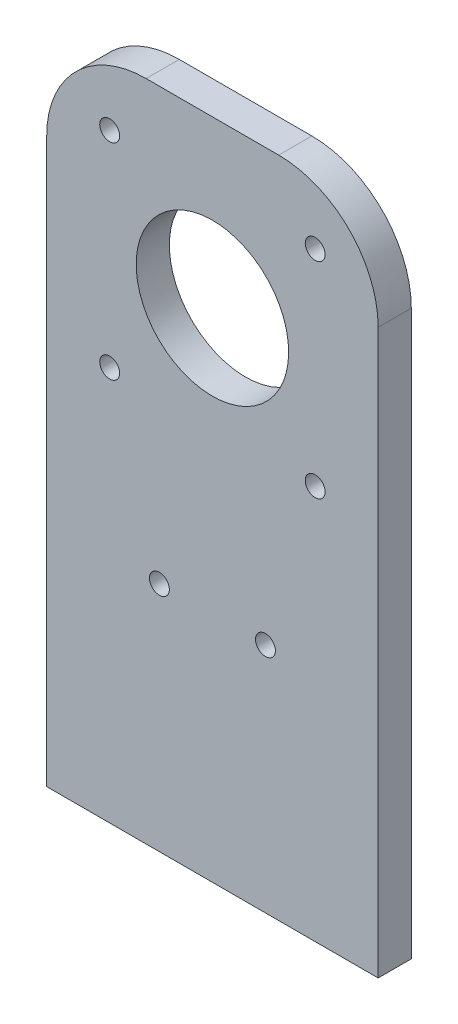
ISO-10303-21;
HEADER;
FILE_DESCRIPTION(('STEP AP214'),'2;1');
FILE_NAME('part.step','',(''),(''),'','','');
FILE_SCHEMA(('AUTOMOTIVE_DESIGN { 1 0 10303 214 1 1 1 1 }'));
ENDSEC;
DATA;
#1=APPLICATION_CONTEXT('core data for automotive mechanical design processes');
#2=APPLICATION_PROTOCOL_DEFINITION('international standard','automotive_design',2000,#1);
#3=PRODUCT_CONTEXT('',#1,'mechanical');
#4=PRODUCT('Part','Part','',(#3));
#5=PRODUCT_RELATED_PRODUCT_CATEGORY('part','',(#4));
#6=PRODUCT_DEFINITION_FORMATION('','',#4);
#7=PRODUCT_DEFINITION_CONTEXT('part definition',#1,'design');
#8=PRODUCT_DEFINITION('design','',#6,#7);
#9=PRODUCT_DEFINITION_SHAPE('','',#8);
#10=(LENGTH_UNIT() NAMED_UNIT(*) SI_UNIT(.MILLI.,.METRE.));
#11=(NAMED_UNIT(*) PLANE_ANGLE_UNIT() SI_UNIT($,.RADIAN.));
#12=(NAMED_UNIT(*) SI_UNIT($,.STERADIAN.) SOLID_ANGLE_UNIT());
#13=UNCERTAINTY_MEASURE_WITH_UNIT(LENGTH_MEASURE(1.E-05),#10,'distance_accuracy_value','');
#14=(GEOMETRIC_REPRESENTATION_CONTEXT(3) GLOBAL_UNCERTAINTY_ASSIGNED_CONTEXT((#13)) GLOBAL_UNIT_ASSIGNED_CONTEXT((#10,
#11,#12)) REPRESENTATION_CONTEXT('',''));
#15=CARTESIAN_POINT('',(0.,0.,0.));
#16=DIRECTION('',(0.,0.,1.));
#17=DIRECTION('',(1.,0.,0.));
#18=AXIS2_PLACEMENT_3D('',#15,#16,#17);
#19=CARTESIAN_POINT('',(9.91259609725116,92.0888197016812,5.));
#20=DIRECTION('',(0.,0.,-1.));
#21=DIRECTION('',(-1.,0.,0.));
#22=AXIS2_PLACEMENT_3D('',#19,#20,#21);
#23=PLANE('',#22);
#24=DIRECTION('',(1.,0.,0.));
#25=VECTOR('',#24,1.);
#26=CARTESIAN_POINT('',(-25.0874039027488,7.08881970168123,5.));
#27=LINE('',#26,#25);
#28=CARTESIAN_POINT('',(-25.0874039027488,7.08881970168123,5.));
#29=VERTEX_POINT('',#28);
#30=CARTESIAN_POINT('',(24.9125960972512,7.08881970168123,5.));
#31=VERTEX_POINT('',#30);
#32=EDGE_CURVE('E133',#29,#31,#27,.T.);
#33=ORIENTED_EDGE('',*,*,#32,.T.);
#34=DIRECTION('',(0.,1.,0.));
#35=VECTOR('',#34,1.);
#36=CARTESIAN_POINT('',(24.9125960972512,7.08881970168123,5.));
#37=LINE('',#36,#35);
#38=CARTESIAN_POINT('',(24.9125960972512,92.0888197016811,5.));
#39=VERTEX_POINT('',#38);
#40=EDGE_CURVE('E91',#31,#39,#37,.T.);
#41=ORIENTED_EDGE('',*,*,#40,.T.);
#42=CARTESIAN_POINT('',(9.91259609725116,92.0888197016812,5.));
#43=DIRECTION('',(0.,0.,1.));
#44=DIRECTION('',(-1.,0.,0.));
#45=AXIS2_PLACEMENT_3D('',#42,#43,#44);
#46=CIRCLE('',#45,15.);
#47=CARTESIAN_POINT('',(9.91259609725106,107.088819701681,5.));
#48=VERTEX_POINT('',#47);
#49=EDGE_CURVE('E104',#39,#48,#46,.T.);
#50=ORIENTED_EDGE('',*,*,#49,.T.);
#51=DIRECTION('',(-1.,0.,0.));
#52=VECTOR('',#51,1.);
#53=CARTESIAN_POINT('',(-10.0874039027487,107.088819701681,5.));
#54=LINE('',#53,#52);
#55=CARTESIAN_POINT('',(-10.0874039027487,107.088819701681,5.));
#56=VERTEX_POINT('',#55);
#57=EDGE_CURVE('E98',#48,#56,#54,.T.);
#58=ORIENTED_EDGE('',*,*,#57,.T.);
#59=CARTESIAN_POINT('',(-10.0874039027488,92.0888197016812,5.));
#60=DIRECTION('',(0.,0.,1.));
#61=DIRECTION('',(-1.,0.,0.));
#62=AXIS2_PLACEMENT_3D('',#59,#60,#61);
#63=CIRCLE('',#62,15.);
#64=CARTESIAN_POINT('',(-25.0874039027488,92.0888197016811,5.));
#65=VERTEX_POINT('',#64);
#66=EDGE_CURVE('E102',#56,#65,#63,.T.);
#67=ORIENTED_EDGE('',*,*,#66,.T.);
#68=DIRECTION('',(0.,-1.,0.));
#69=VECTOR('',#68,1.);
#70=CARTESIAN_POINT('',(-25.0874039027488,92.0888197016811,5.));
#71=LINE('',#70,#69);
#72=EDGE_CURVE('E54',#65,#29,#71,.T.);
#73=ORIENTED_EDGE('',*,*,#72,.T.);
#74=EDGE_LOOP('',(#33,#41,#50,#58,#67,#73));
#75=FACE_BOUND('',#74,.T.);
#76=CARTESIAN_POINT('',(-0.0874039027488199,82.0888197016812,5.));
#77=DIRECTION('',(0.,0.,1.));
#78=DIRECTION('',(1.,0.,0.));
#79=AXIS2_PLACEMENT_3D('',#76,#77,#78);
#80=CIRCLE('',#79,11.5);
#81=CARTESIAN_POINT('',(11.4125960972512,82.0888197016812,5.));
#82=VERTEX_POINT('',#81);
#83=EDGE_CURVE('E126',#82,#82,#80,.T.);
#84=ORIENTED_EDGE('',*,*,#83,.F.);
#85=EDGE_LOOP('',(#84));
#86=FACE_BOUND('',#85,.T.);
#87=CARTESIAN_POINT('',(15.4125960972512,66.5888197016812,5.));
#88=DIRECTION('',(0.,0.,1.));
#89=DIRECTION('',(1.,0.,0.));
#90=AXIS2_PLACEMENT_3D('',#87,#88,#89);
#91=CIRCLE('',#90,1.5);
#92=CARTESIAN_POINT('',(16.9125960972512,66.5888197016812,5.));
#93=VERTEX_POINT('',#92);
#94=EDGE_CURVE('E227',#93,#93,#91,.T.);
#95=ORIENTED_EDGE('',*,*,#94,.F.);
#96=EDGE_LOOP('',(#95));
#97=FACE_BOUND('',#96,.T.);
#98=CARTESIAN_POINT('',(-15.5874039027488,66.5888197016812,5.));
#99=DIRECTION('',(0.,0.,1.));
#100=DIRECTION('',(-1.,0.,0.));
#101=AXIS2_PLACEMENT_3D('',#98,#99,#100);
#102=CIRCLE('',#101,1.5);
#103=CARTESIAN_POINT('',(-17.0874039027488,66.5888197016812,5.));
#104=VERTEX_POINT('',#103);
#105=EDGE_CURVE('E221',#104,#104,#102,.T.);
#106=ORIENTED_EDGE('',*,*,#105,.F.);
#107=EDGE_LOOP('',(#106));
#108=FACE_BOUND('',#107,.T.);
#109=CARTESIAN_POINT('',(15.4125960972512,97.5888197016812,5.));
#110=DIRECTION('',(0.,0.,1.));
#111=DIRECTION('',(-1.,0.,0.));
#112=AXIS2_PLACEMENT_3D('',#109,#110,#111);
#113=CIRCLE('',#112,1.5);
#114=CARTESIAN_POINT('',(13.9125960972512,97.5888197016812,5.));
#115=VERTEX_POINT('',#114);
#116=EDGE_CURVE('E215',#115,#115,#113,.T.);
#117=ORIENTED_EDGE('',*,*,#116,.F.);
#118=EDGE_LOOP('',(#117));
#119=FACE_BOUND('',#118,.T.);
#120=CARTESIAN_POINT('',(-15.5874039027488,97.5888197016812,5.));
#121=DIRECTION('',(0.,0.,1.));
#122=DIRECTION('',(1.,0.,0.));
#123=AXIS2_PLACEMENT_3D('',#120,#121,#122);
#124=CIRCLE('',#123,1.5);
#125=CARTESIAN_POINT('',(-14.0874039027488,97.5888197016812,5.));
#126=VERTEX_POINT('',#125);
#127=EDGE_CURVE('E209',#126,#126,#124,.T.);
#128=ORIENTED_EDGE('',*,*,#127,.F.);
#129=EDGE_LOOP('',(#128));
#130=FACE_BOUND('',#129,.T.);
#131=CARTESIAN_POINT('',(-8.08740390274882,42.0888197016812,5.));
#132=DIRECTION('',(0.,0.,1.));
#133=DIRECTION('',(1.,0.,0.));
#134=AXIS2_PLACEMENT_3D('',#131,#132,#133);
#135=CIRCLE('',#134,1.5);
#136=CARTESIAN_POINT('',(-6.58740390274882,42.0888197016812,5.));
#137=VERTEX_POINT('',#136);
#138=EDGE_CURVE('E203',#137,#137,#135,.T.);
#139=ORIENTED_EDGE('',*,*,#138,.F.);
#140=EDGE_LOOP('',(#139));
#141=FACE_BOUND('',#140,.T.);
#142=CARTESIAN_POINT('',(7.91259609725118,42.0888197016812,5.));
#143=DIRECTION('',(0.,0.,1.));
#144=DIRECTION('',(-1.,0.,0.));
#145=AXIS2_PLACEMENT_3D('',#142,#143,#144);
#146=CIRCLE('',#145,1.5);
#147=CARTESIAN_POINT('',(6.41259609725118,42.0888197016812,5.));
#148=VERTEX_POINT('',#147);
#149=EDGE_CURVE('E194',#148,#148,#146,.T.);
#150=ORIENTED_EDGE('',*,*,#149,.F.);
#151=EDGE_LOOP('',(#150));
#152=FACE_BOUND('',#151,.T.);
#153=ADVANCED_FACE('F37',(#75,#86,#97,#108,#119,#130,#141,#152),#23,.F.);
#154=CARTESIAN_POINT('',(9.91259609725116,92.0888197016812,0.));
#155=DIRECTION('',(0.,0.,-1.));
#156=DIRECTION('',(-1.,0.,0.));
#157=AXIS2_PLACEMENT_3D('',#154,#155,#156);
#158=PLANE('',#157);
#159=CARTESIAN_POINT('',(-8.08740390274882,42.0888197016812,0.));
#160=DIRECTION('',(0.,0.,1.));
#161=DIRECTION('',(1.,0.,0.));
#162=AXIS2_PLACEMENT_3D('',#159,#160,#161);
#163=CIRCLE('',#162,1.5);
#164=CARTESIAN_POINT('',(-6.58740390274882,42.0888197016812,0.));
#165=VERTEX_POINT('',#164);
#166=EDGE_CURVE('E200',#165,#165,#163,.T.);
#167=ORIENTED_EDGE('',*,*,#166,.T.);
#168=EDGE_LOOP('',(#167));
#169=FACE_BOUND('',#168,.T.);
#170=CARTESIAN_POINT('',(15.4125960972512,97.5888197016812,0.));
#171=DIRECTION('',(0.,0.,1.));
#172=DIRECTION('',(-1.,0.,0.));
#173=AXIS2_PLACEMENT_3D('',#170,#171,#172);
#174=CIRCLE('',#173,1.5);
#175=CARTESIAN_POINT('',(13.9125960972512,97.5888197016812,0.));
#176=VERTEX_POINT('',#175);
#177=EDGE_CURVE('E212',#176,#176,#174,.T.);
#178=ORIENTED_EDGE('',*,*,#177,.T.);
#179=EDGE_LOOP('',(#178));
#180=FACE_BOUND('',#179,.T.);
#181=CARTESIAN_POINT('',(15.4125960972512,66.5888197016812,0.));
#182=DIRECTION('',(0.,0.,1.));
#183=DIRECTION('',(1.,0.,0.));
#184=AXIS2_PLACEMENT_3D('',#181,#182,#183);
#185=CIRCLE('',#184,1.5);
#186=CARTESIAN_POINT('',(16.9125960972512,66.5888197016812,0.));
#187=VERTEX_POINT('',#186);
#188=EDGE_CURVE('E224',#187,#187,#185,.T.);
#189=ORIENTED_EDGE('',*,*,#188,.T.);
#190=EDGE_LOOP('',(#189));
#191=FACE_BOUND('',#190,.T.);
#192=DIRECTION('',(1.,0.,0.));
#193=VECTOR('',#192,1.);
#194=CARTESIAN_POINT('',(-25.0874039027488,7.08881970168123,0.));
#195=LINE('',#194,#193);
#196=CARTESIAN_POINT('',(-25.0874039027488,7.08881970168123,0.));
#197=VERTEX_POINT('',#196);
#198=CARTESIAN_POINT('',(24.9125960972512,7.08881970168123,0.));
#199=VERTEX_POINT('',#198);
#200=EDGE_CURVE('E122',#197,#199,#195,.T.);
#201=ORIENTED_EDGE('',*,*,#200,.F.);
#202=DIRECTION('',(0.,-1.,0.));
#203=VECTOR('',#202,1.);
#204=CARTESIAN_POINT('',(-25.0874039027488,92.0888197016811,0.));
#205=LINE('',#204,#203);
#206=CARTESIAN_POINT('',(-25.0874039027488,92.0888197016811,0.));
#207=VERTEX_POINT('',#206);
#208=EDGE_CURVE('E83',#207,#197,#205,.T.);
#209=ORIENTED_EDGE('',*,*,#208,.F.);
#210=CARTESIAN_POINT('',(-10.0874039027488,92.0888197016812,0.));
#211=DIRECTION('',(0.,0.,1.));
#212=DIRECTION('',(-1.,0.,0.));
#213=AXIS2_PLACEMENT_3D('',#210,#211,#212);
#214=CIRCLE('',#213,15.);
#215=CARTESIAN_POINT('',(-10.0874039027487,107.088819701681,0.));
#216=VERTEX_POINT('',#215);
#217=EDGE_CURVE('E77',#216,#207,#214,.T.);
#218=ORIENTED_EDGE('',*,*,#217,.F.);
#219=DIRECTION('',(-1.,0.,0.));
#220=VECTOR('',#219,1.);
#221=CARTESIAN_POINT('',(-10.0874039027487,107.088819701681,0.));
#222=LINE('',#221,#220);
#223=CARTESIAN_POINT('',(9.91259609725106,107.088819701681,0.));
#224=VERTEX_POINT('',#223);
#225=EDGE_CURVE('E112',#224,#216,#222,.T.);
#226=ORIENTED_EDGE('',*,*,#225,.F.);
#227=CARTESIAN_POINT('',(9.91259609725116,92.0888197016812,0.));
#228=DIRECTION('',(0.,0.,1.));
#229=DIRECTION('',(-1.,0.,0.));
#230=AXIS2_PLACEMENT_3D('',#227,#228,#229);
#231=CIRCLE('',#230,15.);
#232=CARTESIAN_POINT('',(24.9125960972512,92.0888197016811,0.));
#233=VERTEX_POINT('',#232);
#234=EDGE_CURVE('E128',#233,#224,#231,.T.);
#235=ORIENTED_EDGE('',*,*,#234,.F.);
#236=DIRECTION('',(0.,1.,0.));
#237=VECTOR('',#236,1.);
#238=CARTESIAN_POINT('',(24.9125960972512,7.08881970168123,0.));
#239=LINE('',#238,#237);
#240=EDGE_CURVE('E125',#199,#233,#239,.T.);
#241=ORIENTED_EDGE('',*,*,#240,.F.);
#242=EDGE_LOOP('',(#201,#209,#218,#226,#235,#241));
#243=FACE_BOUND('',#242,.T.);
#244=CARTESIAN_POINT('',(-0.0874039027488199,82.0888197016812,0.));
#245=DIRECTION('',(0.,0.,1.));
#246=DIRECTION('',(1.,0.,0.));
#247=AXIS2_PLACEMENT_3D('',#244,#245,#246);
#248=CIRCLE('',#247,11.5);
#249=CARTESIAN_POINT('',(11.4125960972512,82.0888197016812,0.));
#250=VERTEX_POINT('',#249);
#251=EDGE_CURVE('E230',#250,#250,#248,.T.);
#252=ORIENTED_EDGE('',*,*,#251,.T.);
#253=EDGE_LOOP('',(#252));
#254=FACE_BOUND('',#253,.T.);
#255=CARTESIAN_POINT('',(-15.5874039027488,66.5888197016812,0.));
#256=DIRECTION('',(0.,0.,1.));
#257=DIRECTION('',(-1.,0.,0.));
#258=AXIS2_PLACEMENT_3D('',#255,#256,#257);
#259=CIRCLE('',#258,1.5);
#260=CARTESIAN_POINT('',(-17.0874039027488,66.5888197016812,0.));
#261=VERTEX_POINT('',#260);
#262=EDGE_CURVE('E218',#261,#261,#259,.T.);
#263=ORIENTED_EDGE('',*,*,#262,.T.);
#264=EDGE_LOOP('',(#263));
#265=FACE_BOUND('',#264,.T.);
#266=CARTESIAN_POINT('',(-15.5874039027488,97.5888197016812,0.));
#267=DIRECTION('',(0.,0.,1.));
#268=DIRECTION('',(1.,0.,0.));
#269=AXIS2_PLACEMENT_3D('',#266,#267,#268);
#270=CIRCLE('',#269,1.5);
#271=CARTESIAN_POINT('',(-14.0874039027488,97.5888197016812,0.));
#272=VERTEX_POINT('',#271);
#273=EDGE_CURVE('E206',#272,#272,#270,.T.);
#274=ORIENTED_EDGE('',*,*,#273,.T.);
#275=EDGE_LOOP('',(#274));
#276=FACE_BOUND('',#275,.T.);
#277=CARTESIAN_POINT('',(7.91259609725118,42.0888197016812,0.));
#278=DIRECTION('',(0.,0.,1.));
#279=DIRECTION('',(-1.,0.,0.));
#280=AXIS2_PLACEMENT_3D('',#277,#278,#279);
#281=CIRCLE('',#280,1.5);
#282=CARTESIAN_POINT('',(6.41259609725118,42.0888197016812,0.));
#283=VERTEX_POINT('',#282);
#284=EDGE_CURVE('E197',#283,#283,#281,.T.);
#285=ORIENTED_EDGE('',*,*,#284,.T.);
#286=EDGE_LOOP('',(#285));
#287=FACE_BOUND('',#286,.T.);
#288=ADVANCED_FACE('F142',(#169,#180,#191,#243,#254,#265,#276,#287),#158,.T.);
#289=CARTESIAN_POINT('',(-25.0874039027488,7.08881970168123,5.));
#290=DIRECTION('',(0.,1.,0.));
#291=DIRECTION('',(-1.,0.,0.));
#292=AXIS2_PLACEMENT_3D('',#289,#290,#291);
#293=PLANE('',#292);
#294=ORIENTED_EDGE('',*,*,#200,.T.);
#295=DIRECTION('',(0.,0.,-1.));
#296=VECTOR('',#295,1.);
#297=CARTESIAN_POINT('',(24.9125960972512,7.08881970168123,5.));
#298=LINE('',#297,#296);
#299=EDGE_CURVE('E11',#31,#199,#298,.T.);
#300=ORIENTED_EDGE('',*,*,#299,.F.);
#301=ORIENTED_EDGE('',*,*,#32,.F.);
#302=DIRECTION('',(0.,0.,-1.));
#303=VECTOR('',#302,1.);
#304=CARTESIAN_POINT('',(-25.0874039027488,7.08881970168123,5.));
#305=LINE('',#304,#303);
#306=EDGE_CURVE('E118',#29,#197,#305,.T.);
#307=ORIENTED_EDGE('',*,*,#306,.T.);
#308=EDGE_LOOP('',(#294,#300,#301,#307));
#309=FACE_BOUND('',#308,.T.);
#310=ADVANCED_FACE('F39',(#309),#293,.F.);
#311=CARTESIAN_POINT('',(24.9125960972512,7.08881970168123,5.));
#312=DIRECTION('',(-1.,0.,0.));
#313=DIRECTION('',(0.,0.,1.));
#314=AXIS2_PLACEMENT_3D('',#311,#312,#313);
#315=PLANE('',#314);
#316=ORIENTED_EDGE('',*,*,#240,.T.);
#317=DIRECTION('',(0.,0.,-1.));
#318=VECTOR('',#317,1.);
#319=CARTESIAN_POINT('',(24.9125960972512,92.0888197016811,5.));
#320=LINE('',#319,#318);
#321=EDGE_CURVE('E46',#39,#233,#320,.T.);
#322=ORIENTED_EDGE('',*,*,#321,.F.);
#323=ORIENTED_EDGE('',*,*,#40,.F.);
#324=ORIENTED_EDGE('',*,*,#299,.T.);
#325=EDGE_LOOP('',(#316,#322,#323,#324));
#326=FACE_BOUND('',#325,.T.);
#327=ADVANCED_FACE('F321',(#326),#315,.F.);
#328=CARTESIAN_POINT('',(9.91259609725116,92.0888197016812,5.));
#329=DIRECTION('',(0.,0.,-1.));
#330=DIRECTION('',(-1.,0.,0.));
#331=AXIS2_PLACEMENT_3D('',#328,#329,#330);
#332=CYLINDRICAL_SURFACE('',#331,15.);
#333=ORIENTED_EDGE('',*,*,#234,.T.);
#334=DIRECTION('',(0.,0.,-1.));
#335=VECTOR('',#334,1.);
#336=CARTESIAN_POINT('',(9.91259609725106,107.088819701681,5.));
#337=LINE('',#336,#335);
#338=EDGE_CURVE('E113',#48,#224,#337,.T.);
#339=ORIENTED_EDGE('',*,*,#338,.F.);
#340=ORIENTED_EDGE('',*,*,#49,.F.);
#341=ORIENTED_EDGE('',*,*,#321,.T.);
#342=EDGE_LOOP('',(#333,#339,#340,#341));
#343=FACE_BOUND('',#342,.T.);
#344=ADVANCED_FACE('F139',(#343),#332,.T.);
#345=CARTESIAN_POINT('',(-10.0874039027487,107.088819701681,5.));
#346=DIRECTION('',(0.,-1.,0.));
#347=DIRECTION('',(0.,0.,-1.));
#348=AXIS2_PLACEMENT_3D('',#345,#346,#347);
#349=PLANE('',#348);
#350=ORIENTED_EDGE('',*,*,#225,.T.);
#351=DIRECTION('',(0.,0.,-1.));
#352=VECTOR('',#351,1.);
#353=CARTESIAN_POINT('',(-10.0874039027487,107.088819701681,5.));
#354=LINE('',#353,#352);
#355=EDGE_CURVE('E109',#56,#216,#354,.T.);
#356=ORIENTED_EDGE('',*,*,#355,.F.);
#357=ORIENTED_EDGE('',*,*,#57,.F.);
#358=ORIENTED_EDGE('',*,*,#338,.T.);
#359=EDGE_LOOP('',(#350,#356,#357,#358));
#360=FACE_BOUND('',#359,.T.);
#361=ADVANCED_FACE('F110',(#360),#349,.F.);
#362=CARTESIAN_POINT('',(-10.0874039027488,92.0888197016812,5.));
#363=DIRECTION('',(0.,0.,-1.));
#364=DIRECTION('',(-1.,0.,0.));
#365=AXIS2_PLACEMENT_3D('',#362,#363,#364);
#366=CYLINDRICAL_SURFACE('',#365,15.);
#367=ORIENTED_EDGE('',*,*,#217,.T.);
#368=DIRECTION('',(0.,0.,-1.));
#369=VECTOR('',#368,1.);
#370=CARTESIAN_POINT('',(-25.0874039027488,92.0888197016811,5.));
#371=LINE('',#370,#369);
#372=EDGE_CURVE('E114',#65,#207,#371,.T.);
#373=ORIENTED_EDGE('',*,*,#372,.F.);
#374=ORIENTED_EDGE('',*,*,#66,.F.);
#375=ORIENTED_EDGE('',*,*,#355,.T.);
#376=EDGE_LOOP('',(#367,#373,#374,#375));
#377=FACE_BOUND('',#376,.T.);
#378=ADVANCED_FACE('F116',(#377),#366,.T.);
#379=CARTESIAN_POINT('',(-25.0874039027488,92.0888197016811,5.));
#380=DIRECTION('',(1.,0.,0.));
#381=DIRECTION('',(0.,1.,0.));
#382=AXIS2_PLACEMENT_3D('',#379,#380,#381);
#383=PLANE('',#382);
#384=ORIENTED_EDGE('',*,*,#208,.T.);
#385=ORIENTED_EDGE('',*,*,#306,.F.);
#386=ORIENTED_EDGE('',*,*,#72,.F.);
#387=ORIENTED_EDGE('',*,*,#372,.T.);
#388=EDGE_LOOP('',(#384,#385,#386,#387));
#389=FACE_BOUND('',#388,.T.);
#390=ADVANCED_FACE('F147',(#389),#383,.F.);
#391=CARTESIAN_POINT('',(-0.0874039027488199,82.0888197016812,5.));
#392=DIRECTION('',(0.,0.,-1.));
#393=DIRECTION('',(-1.,0.,0.));
#394=AXIS2_PLACEMENT_3D('',#391,#392,#393);
#395=CYLINDRICAL_SURFACE('',#394,11.5);
#396=ORIENTED_EDGE('',*,*,#83,.T.);
#397=EDGE_LOOP('',(#396));
#398=FACE_BOUND('',#397,.T.);
#399=ORIENTED_EDGE('',*,*,#251,.F.);
#400=EDGE_LOOP('',(#399));
#401=FACE_BOUND('',#400,.T.);
#402=ADVANCED_FACE('F149',(#398,#401),#395,.F.);
#403=CARTESIAN_POINT('',(15.4125960972512,66.5888197016812,5.));
#404=DIRECTION('',(0.,0.,-1.));
#405=DIRECTION('',(-1.,0.,0.));
#406=AXIS2_PLACEMENT_3D('',#403,#404,#405);
#407=CYLINDRICAL_SURFACE('',#406,1.5);
#408=ORIENTED_EDGE('',*,*,#94,.T.);
#409=EDGE_LOOP('',(#408));
#410=FACE_BOUND('',#409,.T.);
#411=ORIENTED_EDGE('',*,*,#188,.F.);
#412=EDGE_LOOP('',(#411));
#413=FACE_BOUND('',#412,.T.);
#414=ADVANCED_FACE('F155',(#410,#413),#407,.F.);
#415=CARTESIAN_POINT('',(-15.5874039027488,66.5888197016812,5.));
#416=DIRECTION('',(0.,0.,-1.));
#417=DIRECTION('',(-1.,0.,0.));
#418=AXIS2_PLACEMENT_3D('',#415,#416,#417);
#419=CYLINDRICAL_SURFACE('',#418,1.5);
#420=ORIENTED_EDGE('',*,*,#105,.T.);
#421=EDGE_LOOP('',(#420));
#422=FACE_BOUND('',#421,.T.);
#423=ORIENTED_EDGE('',*,*,#262,.F.);
#424=EDGE_LOOP('',(#423));
#425=FACE_BOUND('',#424,.T.);
#426=ADVANCED_FACE('F169',(#422,#425),#419,.F.);
#427=CARTESIAN_POINT('',(15.4125960972512,97.5888197016812,5.));
#428=DIRECTION('',(0.,0.,-1.));
#429=DIRECTION('',(-1.,0.,0.));
#430=AXIS2_PLACEMENT_3D('',#427,#428,#429);
#431=CYLINDRICAL_SURFACE('',#430,1.5);
#432=ORIENTED_EDGE('',*,*,#116,.T.);
#433=EDGE_LOOP('',(#432));
#434=FACE_BOUND('',#433,.T.);
#435=ORIENTED_EDGE('',*,*,#177,.F.);
#436=EDGE_LOOP('',(#435));
#437=FACE_BOUND('',#436,.T.);
#438=ADVANCED_FACE('F173',(#434,#437),#431,.F.);
#439=CARTESIAN_POINT('',(-15.5874039027488,97.5888197016812,5.));
#440=DIRECTION('',(0.,0.,-1.));
#441=DIRECTION('',(-1.,0.,0.));
#442=AXIS2_PLACEMENT_3D('',#439,#440,#441);
#443=CYLINDRICAL_SURFACE('',#442,1.5);
#444=ORIENTED_EDGE('',*,*,#127,.T.);
#445=EDGE_LOOP('',(#444));
#446=FACE_BOUND('',#445,.T.);
#447=ORIENTED_EDGE('',*,*,#273,.F.);
#448=EDGE_LOOP('',(#447));
#449=FACE_BOUND('',#448,.T.);
#450=ADVANCED_FACE('F177',(#446,#449),#443,.F.);
#451=CARTESIAN_POINT('',(-8.08740390274882,42.0888197016812,5.));
#452=DIRECTION('',(0.,0.,-1.));
#453=DIRECTION('',(-1.,0.,0.));
#454=AXIS2_PLACEMENT_3D('',#451,#452,#453);
#455=CYLINDRICAL_SURFACE('',#454,1.5);
#456=ORIENTED_EDGE('',*,*,#138,.T.);
#457=EDGE_LOOP('',(#456));
#458=FACE_BOUND('',#457,.T.);
#459=ORIENTED_EDGE('',*,*,#166,.F.);
#460=EDGE_LOOP('',(#459));
#461=FACE_BOUND('',#460,.T.);
#462=ADVANCED_FACE('F181',(#458,#461),#455,.F.);
#463=CARTESIAN_POINT('',(7.91259609725118,42.0888197016812,5.));
#464=DIRECTION('',(0.,0.,-1.));
#465=DIRECTION('',(-1.,0.,0.));
#466=AXIS2_PLACEMENT_3D('',#463,#464,#465);
#467=CYLINDRICAL_SURFACE('',#466,1.5);
#468=ORIENTED_EDGE('',*,*,#149,.T.);
#469=EDGE_LOOP('',(#468));
#470=FACE_BOUND('',#469,.T.);
#471=ORIENTED_EDGE('',*,*,#284,.F.);
#472=EDGE_LOOP('',(#471));
#473=FACE_BOUND('',#472,.T.);
#474=ADVANCED_FACE('F185',(#470,#473),#467,.F.);
#475=CLOSED_SHELL('',(#153,#288,#310,#327,#344,#361,#378,#390,#402,#414,#426,#438,#450,#462,#474));
#476=MANIFOLD_SOLID_BREP('B2',#475);
#477=ADVANCED_BREP_SHAPE_REPRESENTATION('',(#18,#476),#14);
#478=SHAPE_DEFINITION_REPRESENTATION(#9,#477);
ENDSEC;
END-ISO-10303-21;
